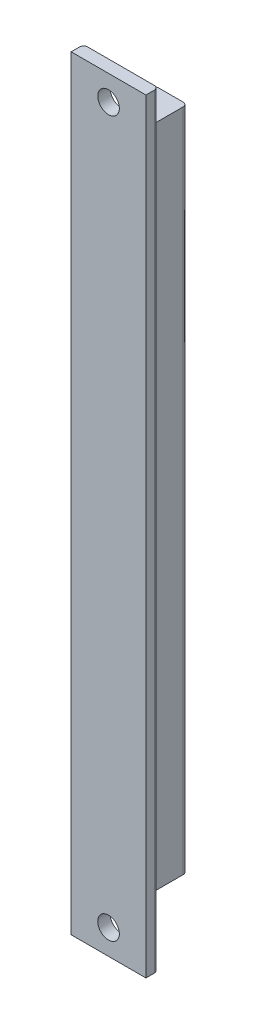
ISO-10303-21;
HEADER;
FILE_DESCRIPTION(('STEP AP214'),'2;1');
FILE_NAME('part.step','',(''),(''),'','','');
FILE_SCHEMA(('AUTOMOTIVE_DESIGN { 1 0 10303 214 1 1 1 1 }'));
ENDSEC;
DATA;
#1=APPLICATION_CONTEXT('core data for automotive mechanical design processes');
#2=APPLICATION_PROTOCOL_DEFINITION('international standard','automotive_design',2000,#1);
#3=PRODUCT_CONTEXT('',#1,'mechanical');
#4=PRODUCT('Part','Part','',(#3));
#5=PRODUCT_RELATED_PRODUCT_CATEGORY('part','',(#4));
#6=PRODUCT_DEFINITION_FORMATION('','',#4);
#7=PRODUCT_DEFINITION_CONTEXT('part definition',#1,'design');
#8=PRODUCT_DEFINITION('design','',#6,#7);
#9=PRODUCT_DEFINITION_SHAPE('','',#8);
#10=(LENGTH_UNIT() NAMED_UNIT(*) SI_UNIT(.MILLI.,.METRE.));
#11=(NAMED_UNIT(*) PLANE_ANGLE_UNIT() SI_UNIT($,.RADIAN.));
#12=(NAMED_UNIT(*) SI_UNIT($,.STERADIAN.) SOLID_ANGLE_UNIT());
#13=UNCERTAINTY_MEASURE_WITH_UNIT(LENGTH_MEASURE(1.E-05),#10,'distance_accuracy_value','');
#14=(GEOMETRIC_REPRESENTATION_CONTEXT(3) GLOBAL_UNCERTAINTY_ASSIGNED_CONTEXT((#13)) GLOBAL_UNIT_ASSIGNED_CONTEXT((#10,
#11,#12)) REPRESENTATION_CONTEXT('',''));
#15=CARTESIAN_POINT('',(0.,0.,0.));
#16=DIRECTION('',(0.,0.,1.));
#17=DIRECTION('',(1.,0.,0.));
#18=AXIS2_PLACEMENT_3D('',#15,#16,#17);
#19=CARTESIAN_POINT('',(11.9,160.,-2.));
#20=DIRECTION('',(-1.,0.,0.));
#21=DIRECTION('',(0.,0.,1.));
#22=AXIS2_PLACEMENT_3D('',#19,#20,#21);
#23=PLANE('',#22);
#24=DIRECTION('',(0.,-1.,0.));
#25=VECTOR('',#24,1.);
#26=CARTESIAN_POINT('',(11.9,160.,-2.));
#27=LINE('',#26,#25);
#28=CARTESIAN_POINT('',(11.9,172.,-2.));
#29=VERTEX_POINT('',#28);
#30=CARTESIAN_POINT('',(11.9,-12.,-2.));
#31=VERTEX_POINT('',#30);
#32=EDGE_CURVE('E149',#29,#31,#27,.T.);
#33=ORIENTED_EDGE('',*,*,#32,.T.);
#34=DIRECTION('',(0.,0.,1.));
#35=VECTOR('',#34,1.);
#36=CARTESIAN_POINT('',(11.9,-12.,-2.));
#37=LINE('',#36,#35);
#38=CARTESIAN_POINT('',(11.9,-12.,-3.99999999999999));
#39=VERTEX_POINT('',#38);
#40=EDGE_CURVE('E182',#39,#31,#37,.T.);
#41=ORIENTED_EDGE('',*,*,#40,.F.);
#42=DIRECTION('',(0.,-1.,0.));
#43=VECTOR('',#42,1.);
#44=CARTESIAN_POINT('',(11.9,160.,-3.99999999999999));
#45=LINE('',#44,#43);
#46=CARTESIAN_POINT('',(11.9,172.,-3.99999999999999));
#47=VERTEX_POINT('',#46);
#48=EDGE_CURVE('E146',#47,#39,#45,.T.);
#49=ORIENTED_EDGE('',*,*,#48,.F.);
#50=DIRECTION('',(0.,0.,1.));
#51=VECTOR('',#50,1.);
#52=CARTESIAN_POINT('',(11.9,172.,-4.));
#53=LINE('',#52,#51);
#54=EDGE_CURVE('E157',#47,#29,#53,.T.);
#55=ORIENTED_EDGE('',*,*,#54,.T.);
#56=EDGE_LOOP('',(#33,#41,#49,#55));
#57=FACE_BOUND('',#56,.T.);
#58=ADVANCED_FACE('F36',(#57),#23,.F.);
#59=CARTESIAN_POINT('',(10.9,160.,-4.));
#60=DIRECTION('',(0.,-1.,0.));
#61=DIRECTION('',(0.,0.,-1.));
#62=AXIS2_PLACEMENT_3D('',#59,#60,#61);
#63=CYLINDRICAL_SURFACE('',#62,1.);
#64=ORIENTED_EDGE('',*,*,#48,.T.);
#65=CARTESIAN_POINT('',(10.9,-12.,-4.));
#66=DIRECTION('',(0.,-1.,0.));
#67=DIRECTION('',(0.,0.,-1.));
#68=AXIS2_PLACEMENT_3D('',#65,#66,#67);
#69=CIRCLE('',#68,1.);
#70=CARTESIAN_POINT('',(10.9,-12.,-5.));
#71=VERTEX_POINT('',#70);
#72=EDGE_CURVE('E117',#71,#39,#69,.T.);
#73=ORIENTED_EDGE('',*,*,#72,.F.);
#74=DIRECTION('',(0.,-1.,0.));
#75=VECTOR('',#74,1.);
#76=CARTESIAN_POINT('',(10.9,160.,-5.));
#77=LINE('',#76,#75);
#78=CARTESIAN_POINT('',(10.9,172.,-5.));
#79=VERTEX_POINT('',#78);
#80=EDGE_CURVE('E143',#79,#71,#77,.T.);
#81=ORIENTED_EDGE('',*,*,#80,.F.);
#82=CARTESIAN_POINT('',(10.9,172.,-4.));
#83=DIRECTION('',(0.,-1.,0.));
#84=DIRECTION('',(0.,0.,-1.));
#85=AXIS2_PLACEMENT_3D('',#82,#83,#84);
#86=CIRCLE('',#85,1.);
#87=EDGE_CURVE('E180',#79,#47,#86,.T.);
#88=ORIENTED_EDGE('',*,*,#87,.T.);
#89=EDGE_LOOP('',(#64,#73,#81,#88));
#90=FACE_BOUND('',#89,.T.);
#91=ADVANCED_FACE('F223',(#90),#63,.T.);
#92=CARTESIAN_POINT('',(6.85,160.,-5.));
#93=DIRECTION('',(-1.,0.,0.));
#94=DIRECTION('',(0.,0.,1.));
#95=AXIS2_PLACEMENT_3D('',#92,#93,#94);
#96=PLANE('',#95);
#97=DIRECTION('',(0.,0.,-1.));
#98=VECTOR('',#97,1.);
#99=CARTESIAN_POINT('',(6.85,0.,-5.));
#100=LINE('',#99,#98);
#101=CARTESIAN_POINT('',(6.85,0.,-5.));
#102=VERTEX_POINT('',#101);
#103=CARTESIAN_POINT('',(6.85,0.,-16.));
#104=VERTEX_POINT('',#103);
#105=EDGE_CURVE('E114',#102,#104,#100,.T.);
#106=ORIENTED_EDGE('',*,*,#105,.T.);
#107=DIRECTION('',(0.,-1.,0.));
#108=VECTOR('',#107,1.);
#109=CARTESIAN_POINT('',(6.85,160.,-16.));
#110=LINE('',#109,#108);
#111=CARTESIAN_POINT('',(6.85,160.,-16.));
#112=VERTEX_POINT('',#111);
#113=EDGE_CURVE('E137',#112,#104,#110,.T.);
#114=ORIENTED_EDGE('',*,*,#113,.F.);
#115=DIRECTION('',(0.,0.,-1.));
#116=VECTOR('',#115,1.);
#117=CARTESIAN_POINT('',(6.85,160.,-5.));
#118=LINE('',#117,#116);
#119=CARTESIAN_POINT('',(6.85,160.,-5.));
#120=VERTEX_POINT('',#119);
#121=EDGE_CURVE('E88',#120,#112,#118,.T.);
#122=ORIENTED_EDGE('',*,*,#121,.F.);
#123=DIRECTION('',(0.,-1.,0.));
#124=VECTOR('',#123,1.);
#125=CARTESIAN_POINT('',(6.85,160.,-5.));
#126=LINE('',#125,#124);
#127=EDGE_CURVE('E140',#120,#102,#126,.T.);
#128=ORIENTED_EDGE('',*,*,#127,.T.);
#129=EDGE_LOOP('',(#106,#114,#122,#128));
#130=FACE_BOUND('',#129,.T.);
#131=ADVANCED_FACE('F211',(#130),#96,.F.);
#132=CARTESIAN_POINT('',(5.85,160.,-16.));
#133=DIRECTION('',(0.,-1.,0.));
#134=DIRECTION('',(0.,0.,-1.));
#135=AXIS2_PLACEMENT_3D('',#132,#133,#134);
#136=CYLINDRICAL_SURFACE('',#135,1.);
#137=CARTESIAN_POINT('',(5.85,0.,-16.));
#138=DIRECTION('',(0.,1.,0.));
#139=DIRECTION('',(0.,0.,1.));
#140=AXIS2_PLACEMENT_3D('',#137,#138,#139);
#141=CIRCLE('',#140,1.);
#142=CARTESIAN_POINT('',(5.85,0.,-17.));
#143=VERTEX_POINT('',#142);
#144=EDGE_CURVE('E116',#104,#143,#141,.T.);
#145=ORIENTED_EDGE('',*,*,#144,.T.);
#146=DIRECTION('',(0.,-1.,0.));
#147=VECTOR('',#146,1.);
#148=CARTESIAN_POINT('',(5.85,160.,-17.));
#149=LINE('',#148,#147);
#150=CARTESIAN_POINT('',(5.85,160.,-17.));
#151=VERTEX_POINT('',#150);
#152=EDGE_CURVE('E105',#151,#143,#149,.T.);
#153=ORIENTED_EDGE('',*,*,#152,.F.);
#154=CARTESIAN_POINT('',(5.85,160.,-16.));
#155=DIRECTION('',(0.,1.,0.));
#156=DIRECTION('',(0.,0.,1.));
#157=AXIS2_PLACEMENT_3D('',#154,#155,#156);
#158=CIRCLE('',#157,1.);
#159=EDGE_CURVE('E100',#112,#151,#158,.T.);
#160=ORIENTED_EDGE('',*,*,#159,.F.);
#161=ORIENTED_EDGE('',*,*,#113,.T.);
#162=EDGE_LOOP('',(#145,#153,#160,#161));
#163=FACE_BOUND('',#162,.T.);
#164=ADVANCED_FACE('F215',(#163),#136,.T.);
#165=CARTESIAN_POINT('',(-0.0500000000000006,160.,-17.));
#166=DIRECTION('',(0.,0.,1.));
#167=DIRECTION('',(1.,0.,0.));
#168=AXIS2_PLACEMENT_3D('',#165,#166,#167);
#169=PLANE('',#168);
#170=DIRECTION('',(-1.,0.,0.));
#171=VECTOR('',#170,1.);
#172=CARTESIAN_POINT('',(-0.0500000000000006,0.,-17.));
#173=LINE('',#172,#171);
#174=CARTESIAN_POINT('',(-0.0500000000000004,0.,-17.));
#175=VERTEX_POINT('',#174);
#176=EDGE_CURVE('E74',#143,#175,#173,.T.);
#177=ORIENTED_EDGE('',*,*,#176,.T.);
#178=DIRECTION('',(0.,-1.,0.));
#179=VECTOR('',#178,1.);
#180=CARTESIAN_POINT('',(-0.0500000000000004,160.,-17.));
#181=LINE('',#180,#179);
#182=CARTESIAN_POINT('',(-0.0500000000000004,160.,-17.));
#183=VERTEX_POINT('',#182);
#184=EDGE_CURVE('E103',#183,#175,#181,.T.);
#185=ORIENTED_EDGE('',*,*,#184,.F.);
#186=DIRECTION('',(-1.,0.,0.));
#187=VECTOR('',#186,1.);
#188=CARTESIAN_POINT('',(-0.0500000000000006,160.,-17.));
#189=LINE('',#188,#187);
#190=EDGE_CURVE('E95',#151,#183,#189,.T.);
#191=ORIENTED_EDGE('',*,*,#190,.F.);
#192=ORIENTED_EDGE('',*,*,#152,.T.);
#193=EDGE_LOOP('',(#177,#185,#191,#192));
#194=FACE_BOUND('',#193,.T.);
#195=ADVANCED_FACE('F104',(#194),#169,.F.);
#196=CARTESIAN_POINT('',(-0.0500000000000006,160.,-16.));
#197=DIRECTION('',(0.,-1.,0.));
#198=DIRECTION('',(0.,0.,-1.));
#199=AXIS2_PLACEMENT_3D('',#196,#197,#198);
#200=CYLINDRICAL_SURFACE('',#199,1.);
#201=CARTESIAN_POINT('',(-0.0500000000000006,0.,-16.));
#202=DIRECTION('',(0.,1.,0.));
#203=DIRECTION('',(0.,0.,1.));
#204=AXIS2_PLACEMENT_3D('',#201,#202,#203);
#205=CIRCLE('',#204,1.);
#206=CARTESIAN_POINT('',(-1.05,0.,-16.));
#207=VERTEX_POINT('',#206);
#208=EDGE_CURVE('E81',#175,#207,#205,.T.);
#209=ORIENTED_EDGE('',*,*,#208,.T.);
#210=DIRECTION('',(0.,-1.,0.));
#211=VECTOR('',#210,1.);
#212=CARTESIAN_POINT('',(-1.05,160.,-16.));
#213=LINE('',#212,#211);
#214=CARTESIAN_POINT('',(-1.05,160.,-16.));
#215=VERTEX_POINT('',#214);
#216=EDGE_CURVE('E106',#215,#207,#213,.T.);
#217=ORIENTED_EDGE('',*,*,#216,.F.);
#218=CARTESIAN_POINT('',(-0.0500000000000006,160.,-16.));
#219=DIRECTION('',(0.,1.,0.));
#220=DIRECTION('',(0.,0.,1.));
#221=AXIS2_PLACEMENT_3D('',#218,#219,#220);
#222=CIRCLE('',#221,1.);
#223=EDGE_CURVE('E98',#183,#215,#222,.T.);
#224=ORIENTED_EDGE('',*,*,#223,.F.);
#225=ORIENTED_EDGE('',*,*,#184,.T.);
#226=EDGE_LOOP('',(#209,#217,#224,#225));
#227=FACE_BOUND('',#226,.T.);
#228=ADVANCED_FACE('F108',(#227),#200,.T.);
#229=CARTESIAN_POINT('',(-1.05,160.,-5.));
#230=DIRECTION('',(1.,0.,0.));
#231=DIRECTION('',(0.,0.,-1.));
#232=AXIS2_PLACEMENT_3D('',#229,#230,#231);
#233=PLANE('',#232);
#234=DIRECTION('',(0.,0.,1.));
#235=VECTOR('',#234,1.);
#236=CARTESIAN_POINT('',(-1.05,0.,-5.));
#237=LINE('',#236,#235);
#238=CARTESIAN_POINT('',(-1.05,0.,-5.));
#239=VERTEX_POINT('',#238);
#240=EDGE_CURVE('E121',#207,#239,#237,.T.);
#241=ORIENTED_EDGE('',*,*,#240,.T.);
#242=DIRECTION('',(0.,-1.,0.));
#243=VECTOR('',#242,1.);
#244=CARTESIAN_POINT('',(-1.05,160.,-5.));
#245=LINE('',#244,#243);
#246=CARTESIAN_POINT('',(-1.05,160.,-5.));
#247=VERTEX_POINT('',#246);
#248=EDGE_CURVE('E132',#247,#239,#245,.T.);
#249=ORIENTED_EDGE('',*,*,#248,.F.);
#250=DIRECTION('',(0.,0.,1.));
#251=VECTOR('',#250,1.);
#252=CARTESIAN_POINT('',(-1.05,160.,-5.));
#253=LINE('',#252,#251);
#254=EDGE_CURVE('E53',#215,#247,#253,.T.);
#255=ORIENTED_EDGE('',*,*,#254,.F.);
#256=ORIENTED_EDGE('',*,*,#216,.T.);
#257=EDGE_LOOP('',(#241,#249,#255,#256));
#258=FACE_BOUND('',#257,.T.);
#259=ADVANCED_FACE('F285',(#258),#233,.F.);
#260=CARTESIAN_POINT('',(-1.05,160.,-5.));
#261=DIRECTION('',(0.,0.,1.));
#262=DIRECTION('',(1.,0.,0.));
#263=AXIS2_PLACEMENT_3D('',#260,#261,#262);
#264=PLANE('',#263);
#265=CARTESIAN_POINT('',(2.89999999999999,166.,-5.));
#266=DIRECTION('',(0.,0.,-1.));
#267=DIRECTION('',(-1.,0.,0.));
#268=AXIS2_PLACEMENT_3D('',#265,#266,#267);
#269=CIRCLE('',#268,2.6);
#270=CARTESIAN_POINT('',(0.299999999999999,166.,-5.));
#271=VERTEX_POINT('',#270);
#272=EDGE_CURVE('E153',#271,#271,#269,.T.);
#273=ORIENTED_EDGE('',*,*,#272,.F.);
#274=EDGE_LOOP('',(#273));
#275=FACE_BOUND('',#274,.T.);
#276=CARTESIAN_POINT('',(2.89999999999997,-6.,-5.));
#277=DIRECTION('',(0.,0.,-1.));
#278=DIRECTION('',(-1.,0.,0.));
#279=AXIS2_PLACEMENT_3D('',#276,#277,#278);
#280=CIRCLE('',#279,2.6);
#281=CARTESIAN_POINT('',(0.299999999999973,-6.,-5.));
#282=VERTEX_POINT('',#281);
#283=EDGE_CURVE('E159',#282,#282,#280,.T.);
#284=ORIENTED_EDGE('',*,*,#283,.F.);
#285=EDGE_LOOP('',(#284));
#286=FACE_BOUND('',#285,.T.);
#287=DIRECTION('',(0.,-1.,0.));
#288=VECTOR('',#287,1.);
#289=CARTESIAN_POINT('',(-5.1,160.,-5.));
#290=LINE('',#289,#288);
#291=CARTESIAN_POINT('',(-5.1,172.,-5.));
#292=VERTEX_POINT('',#291);
#293=CARTESIAN_POINT('',(-5.09999999999999,-12.,-5.));
#294=VERTEX_POINT('',#293);
#295=EDGE_CURVE('E129',#292,#294,#290,.T.);
#296=ORIENTED_EDGE('',*,*,#295,.F.);
#297=DIRECTION('',(1.,0.,0.));
#298=VECTOR('',#297,1.);
#299=CARTESIAN_POINT('',(-5.1,172.,-5.));
#300=LINE('',#299,#298);
#301=EDGE_CURVE('E177',#292,#79,#300,.T.);
#302=ORIENTED_EDGE('',*,*,#301,.T.);
#303=ORIENTED_EDGE('',*,*,#80,.T.);
#304=DIRECTION('',(1.,0.,0.));
#305=VECTOR('',#304,1.);
#306=CARTESIAN_POINT('',(10.9,-12.,-5.));
#307=LINE('',#306,#305);
#308=EDGE_CURVE('E195',#294,#71,#307,.T.);
#309=ORIENTED_EDGE('',*,*,#308,.F.);
#310=EDGE_LOOP('',(#296,#302,#303,#309));
#311=FACE_BOUND('',#310,.T.);
#312=ORIENTED_EDGE('',*,*,#248,.T.);
#313=DIRECTION('',(1.,0.,0.));
#314=VECTOR('',#313,1.);
#315=CARTESIAN_POINT('',(10.9,0.,-5.));
#316=LINE('',#315,#314);
#317=EDGE_CURVE('E45',#239,#102,#316,.T.);
#318=ORIENTED_EDGE('',*,*,#317,.T.);
#319=ORIENTED_EDGE('',*,*,#127,.F.);
#320=DIRECTION('',(1.,0.,0.));
#321=VECTOR('',#320,1.);
#322=CARTESIAN_POINT('',(-5.1,160.,-5.));
#323=LINE('',#322,#321);
#324=EDGE_CURVE('E11',#247,#120,#323,.T.);
#325=ORIENTED_EDGE('',*,*,#324,.F.);
#326=EDGE_LOOP('',(#312,#318,#319,#325));
#327=FACE_BOUND('',#326,.T.);
#328=ADVANCED_FACE('F204',(#275,#286,#311,#327),#264,.F.);
#329=CARTESIAN_POINT('',(-5.1,160.,-4.));
#330=DIRECTION('',(0.,-1.,0.));
#331=DIRECTION('',(0.,0.,-1.));
#332=AXIS2_PLACEMENT_3D('',#329,#330,#331);
#333=CYLINDRICAL_SURFACE('',#332,1.);
#334=ORIENTED_EDGE('',*,*,#295,.T.);
#335=CARTESIAN_POINT('',(-5.1,-12.,-4.));
#336=DIRECTION('',(0.,-1.,0.));
#337=DIRECTION('',(0.,0.,1.));
#338=AXIS2_PLACEMENT_3D('',#335,#336,#337);
#339=CIRCLE('',#338,1.);
#340=CARTESIAN_POINT('',(-6.1,-12.,-3.99999999999999));
#341=VERTEX_POINT('',#340);
#342=EDGE_CURVE('E192',#341,#294,#339,.T.);
#343=ORIENTED_EDGE('',*,*,#342,.F.);
#344=DIRECTION('',(0.,-1.,0.));
#345=VECTOR('',#344,1.);
#346=CARTESIAN_POINT('',(-6.1,160.,-3.99999999999999));
#347=LINE('',#346,#345);
#348=CARTESIAN_POINT('',(-6.1,172.,-3.99999999999999));
#349=VERTEX_POINT('',#348);
#350=EDGE_CURVE('E126',#349,#341,#347,.T.);
#351=ORIENTED_EDGE('',*,*,#350,.F.);
#352=CARTESIAN_POINT('',(-5.1,172.,-4.));
#353=DIRECTION('',(0.,-1.,0.));
#354=DIRECTION('',(0.,0.,-1.));
#355=AXIS2_PLACEMENT_3D('',#352,#353,#354);
#356=CIRCLE('',#355,1.);
#357=EDGE_CURVE('E174',#349,#292,#356,.T.);
#358=ORIENTED_EDGE('',*,*,#357,.T.);
#359=EDGE_LOOP('',(#334,#343,#351,#358));
#360=FACE_BOUND('',#359,.T.);
#361=ADVANCED_FACE('F282',(#360),#333,.T.);
#362=CARTESIAN_POINT('',(-6.1,160.,-2.));
#363=DIRECTION('',(1.,0.,0.));
#364=DIRECTION('',(0.,0.,-1.));
#365=AXIS2_PLACEMENT_3D('',#362,#363,#364);
#366=PLANE('',#365);
#367=ORIENTED_EDGE('',*,*,#350,.T.);
#368=DIRECTION('',(0.,0.,-1.));
#369=VECTOR('',#368,1.);
#370=CARTESIAN_POINT('',(-6.1,-12.,-2.));
#371=LINE('',#370,#369);
#372=CARTESIAN_POINT('',(-6.1,-12.,-2.));
#373=VERTEX_POINT('',#372);
#374=EDGE_CURVE('E189',#373,#341,#371,.T.);
#375=ORIENTED_EDGE('',*,*,#374,.F.);
#376=DIRECTION('',(0.,-1.,0.));
#377=VECTOR('',#376,1.);
#378=CARTESIAN_POINT('',(-6.1,160.,-2.));
#379=LINE('',#378,#377);
#380=CARTESIAN_POINT('',(-6.1,172.,-2.));
#381=VERTEX_POINT('',#380);
#382=EDGE_CURVE('E110',#381,#373,#379,.T.);
#383=ORIENTED_EDGE('',*,*,#382,.F.);
#384=DIRECTION('',(0.,0.,-1.));
#385=VECTOR('',#384,1.);
#386=CARTESIAN_POINT('',(-6.1,172.,-4.));
#387=LINE('',#386,#385);
#388=EDGE_CURVE('E171',#381,#349,#387,.T.);
#389=ORIENTED_EDGE('',*,*,#388,.T.);
#390=EDGE_LOOP('',(#367,#375,#383,#389));
#391=FACE_BOUND('',#390,.T.);
#392=ADVANCED_FACE('F275',(#391),#366,.F.);
#393=CARTESIAN_POINT('',(0.,160.,-2.));
#394=DIRECTION('',(0.,0.,-1.));
#395=DIRECTION('',(-1.,0.,0.));
#396=AXIS2_PLACEMENT_3D('',#393,#394,#395);
#397=PLANE('',#396);
#398=CARTESIAN_POINT('',(2.9,166.,-2.));
#399=DIRECTION('',(0.,0.,-1.));
#400=DIRECTION('',(-1.,0.,0.));
#401=AXIS2_PLACEMENT_3D('',#398,#399,#400);
#402=CIRCLE('',#401,2.6);
#403=CARTESIAN_POINT('',(0.3,166.,-2.));
#404=VERTEX_POINT('',#403);
#405=EDGE_CURVE('E39',#404,#404,#402,.T.);
#406=ORIENTED_EDGE('',*,*,#405,.T.);
#407=EDGE_LOOP('',(#406));
#408=FACE_BOUND('',#407,.T.);
#409=CARTESIAN_POINT('',(2.89999999999997,-6.,-2.));
#410=DIRECTION('',(0.,0.,-1.));
#411=DIRECTION('',(-1.,0.,0.));
#412=AXIS2_PLACEMENT_3D('',#409,#410,#411);
#413=CIRCLE('',#412,2.6);
#414=CARTESIAN_POINT('',(0.299999999999974,-6.,-2.));
#415=VERTEX_POINT('',#414);
#416=EDGE_CURVE('E151',#415,#415,#413,.T.);
#417=ORIENTED_EDGE('',*,*,#416,.T.);
#418=EDGE_LOOP('',(#417));
#419=FACE_BOUND('',#418,.T.);
#420=ORIENTED_EDGE('',*,*,#382,.T.);
#421=DIRECTION('',(-1.,0.,0.));
#422=VECTOR('',#421,1.);
#423=CARTESIAN_POINT('',(11.9,-12.,-2.));
#424=LINE('',#423,#422);
#425=EDGE_CURVE('E186',#31,#373,#424,.T.);
#426=ORIENTED_EDGE('',*,*,#425,.F.);
#427=ORIENTED_EDGE('',*,*,#32,.F.);
#428=DIRECTION('',(-1.,0.,0.));
#429=VECTOR('',#428,1.);
#430=CARTESIAN_POINT('',(-5.1,172.,-2.));
#431=LINE('',#430,#429);
#432=EDGE_CURVE('E168',#29,#381,#431,.T.);
#433=ORIENTED_EDGE('',*,*,#432,.T.);
#434=EDGE_LOOP('',(#420,#426,#427,#433));
#435=FACE_BOUND('',#434,.T.);
#436=ADVANCED_FACE('F243',(#408,#419,#435),#397,.F.);
#437=CARTESIAN_POINT('',(-5.1,160.,-4.));
#438=DIRECTION('',(0.,-1.,0.));
#439=DIRECTION('',(0.,0.,-1.));
#440=AXIS2_PLACEMENT_3D('',#437,#438,#439);
#441=PLANE('',#440);
#442=ORIENTED_EDGE('',*,*,#254,.T.);
#443=ORIENTED_EDGE('',*,*,#324,.T.);
#444=ORIENTED_EDGE('',*,*,#121,.T.);
#445=ORIENTED_EDGE('',*,*,#159,.T.);
#446=ORIENTED_EDGE('',*,*,#190,.T.);
#447=ORIENTED_EDGE('',*,*,#223,.T.);
#448=EDGE_LOOP('',(#442,#443,#444,#445,#446,#447));
#449=FACE_BOUND('',#448,.T.);
#450=ADVANCED_FACE('F96',(#449),#441,.F.);
#451=CARTESIAN_POINT('',(-5.1,0.,-4.));
#452=DIRECTION('',(0.,-1.,0.));
#453=DIRECTION('',(0.,0.,-1.));
#454=AXIS2_PLACEMENT_3D('',#451,#452,#453);
#455=PLANE('',#454);
#456=ORIENTED_EDGE('',*,*,#317,.F.);
#457=ORIENTED_EDGE('',*,*,#240,.F.);
#458=ORIENTED_EDGE('',*,*,#208,.F.);
#459=ORIENTED_EDGE('',*,*,#176,.F.);
#460=ORIENTED_EDGE('',*,*,#144,.F.);
#461=ORIENTED_EDGE('',*,*,#105,.F.);
#462=EDGE_LOOP('',(#456,#457,#458,#459,#460,#461));
#463=FACE_BOUND('',#462,.T.);
#464=ADVANCED_FACE('F213',(#463),#455,.T.);
#465=CARTESIAN_POINT('',(10.9,-12.,-4.));
#466=DIRECTION('',(0.,-1.,0.));
#467=DIRECTION('',(0.,0.,-1.));
#468=AXIS2_PLACEMENT_3D('',#465,#466,#467);
#469=PLANE('',#468);
#470=ORIENTED_EDGE('',*,*,#40,.T.);
#471=ORIENTED_EDGE('',*,*,#425,.T.);
#472=ORIENTED_EDGE('',*,*,#374,.T.);
#473=ORIENTED_EDGE('',*,*,#342,.T.);
#474=ORIENTED_EDGE('',*,*,#308,.T.);
#475=ORIENTED_EDGE('',*,*,#72,.T.);
#476=EDGE_LOOP('',(#470,#471,#472,#473,#474,#475));
#477=FACE_BOUND('',#476,.T.);
#478=ADVANCED_FACE('F247',(#477),#469,.T.);
#479=CARTESIAN_POINT('',(-5.1,172.,-4.));
#480=DIRECTION('',(0.,-1.,0.));
#481=DIRECTION('',(0.,0.,-1.));
#482=AXIS2_PLACEMENT_3D('',#479,#480,#481);
#483=PLANE('',#482);
#484=ORIENTED_EDGE('',*,*,#54,.F.);
#485=ORIENTED_EDGE('',*,*,#87,.F.);
#486=ORIENTED_EDGE('',*,*,#301,.F.);
#487=ORIENTED_EDGE('',*,*,#357,.F.);
#488=ORIENTED_EDGE('',*,*,#388,.F.);
#489=ORIENTED_EDGE('',*,*,#432,.F.);
#490=EDGE_LOOP('',(#484,#485,#486,#487,#488,#489));
#491=FACE_BOUND('',#490,.T.);
#492=ADVANCED_FACE('F278',(#491),#483,.F.);
#493=CARTESIAN_POINT('',(2.89999999999998,-6.,7.));
#494=DIRECTION('',(0.,0.,-1.));
#495=DIRECTION('',(-1.,0.,0.));
#496=AXIS2_PLACEMENT_3D('',#493,#494,#495);
#497=CYLINDRICAL_SURFACE('',#496,2.6);
#498=ORIENTED_EDGE('',*,*,#283,.T.);
#499=EDGE_LOOP('',(#498));
#500=FACE_BOUND('',#499,.T.);
#501=ORIENTED_EDGE('',*,*,#416,.F.);
#502=EDGE_LOOP('',(#501));
#503=FACE_BOUND('',#502,.T.);
#504=ADVANCED_FACE('F349',(#500,#503),#497,.F.);
#505=CARTESIAN_POINT('',(2.9,166.,7.));
#506=DIRECTION('',(0.,0.,-1.));
#507=DIRECTION('',(-1.,0.,0.));
#508=AXIS2_PLACEMENT_3D('',#505,#506,#507);
#509=CYLINDRICAL_SURFACE('',#508,2.6);
#510=ORIENTED_EDGE('',*,*,#272,.T.);
#511=EDGE_LOOP('',(#510));
#512=FACE_BOUND('',#511,.T.);
#513=ORIENTED_EDGE('',*,*,#405,.F.);
#514=EDGE_LOOP('',(#513));
#515=FACE_BOUND('',#514,.T.);
#516=ADVANCED_FACE('F372',(#512,#515),#509,.F.);
#517=CLOSED_SHELL('',(#58,#91,#131,#164,#195,#228,#259,#328,#361,#392,#436,#450,#464,#478,#492,
#504,#516));
#518=MANIFOLD_SOLID_BREP('B2',#517);
#519=ADVANCED_BREP_SHAPE_REPRESENTATION('',(#18,#518),#14);
#520=SHAPE_DEFINITION_REPRESENTATION(#9,#519);
ENDSEC;
END-ISO-10303-21;
